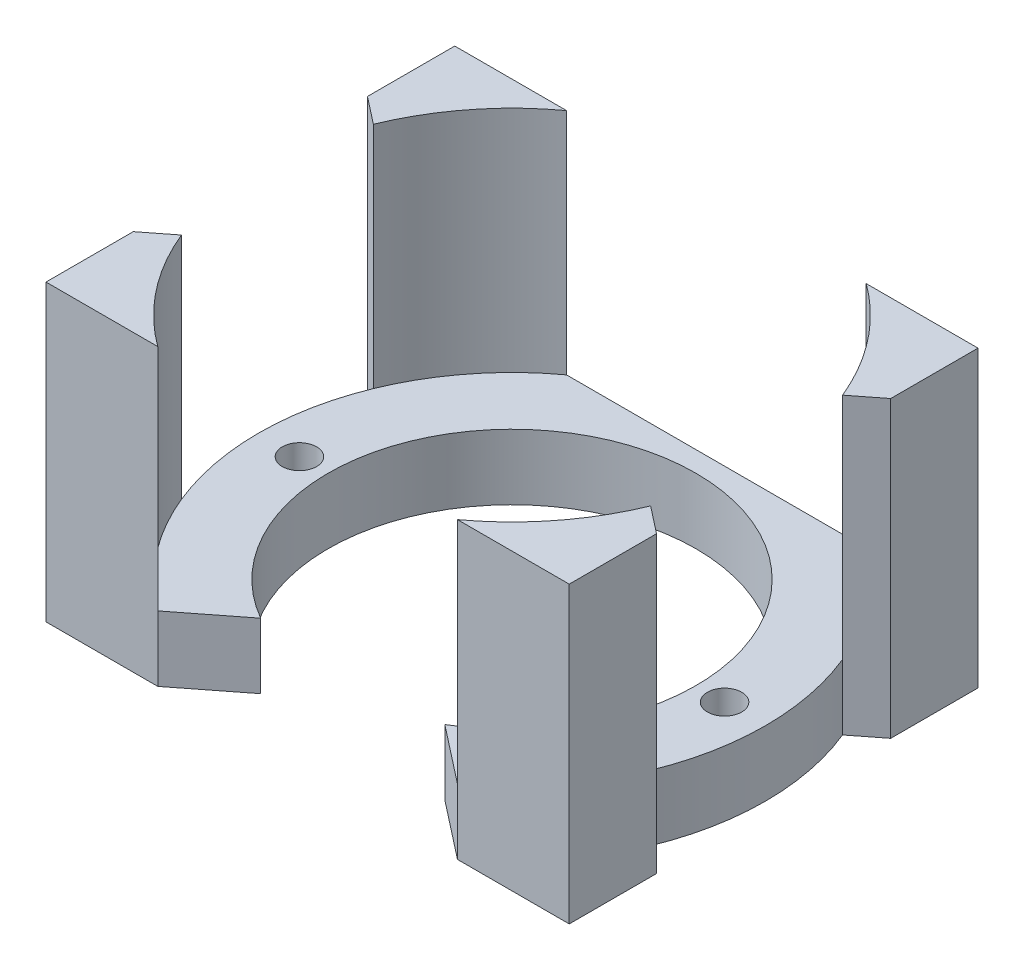
ISO-10303-21;
HEADER;
FILE_DESCRIPTION(('STEP AP214'),'2;1');
FILE_NAME('part.step','',(''),(''),'','','');
FILE_SCHEMA(('AUTOMOTIVE_DESIGN { 1 0 10303 214 1 1 1 1 }'));
ENDSEC;
DATA;
#1=APPLICATION_CONTEXT('core data for automotive mechanical design processes');
#2=APPLICATION_PROTOCOL_DEFINITION('international standard','automotive_design',2000,#1);
#3=PRODUCT_CONTEXT('',#1,'mechanical');
#4=PRODUCT('Part','Part','',(#3));
#5=PRODUCT_RELATED_PRODUCT_CATEGORY('part','',(#4));
#6=PRODUCT_DEFINITION_FORMATION('','',#4);
#7=PRODUCT_DEFINITION_CONTEXT('part definition',#1,'design');
#8=PRODUCT_DEFINITION('design','',#6,#7);
#9=PRODUCT_DEFINITION_SHAPE('','',#8);
#10=(LENGTH_UNIT() NAMED_UNIT(*) SI_UNIT(.MILLI.,.METRE.));
#11=(NAMED_UNIT(*) PLANE_ANGLE_UNIT() SI_UNIT($,.RADIAN.));
#12=(NAMED_UNIT(*) SI_UNIT($,.STERADIAN.) SOLID_ANGLE_UNIT());
#13=UNCERTAINTY_MEASURE_WITH_UNIT(LENGTH_MEASURE(1.E-05),#10,'distance_accuracy_value','');
#14=(GEOMETRIC_REPRESENTATION_CONTEXT(3) GLOBAL_UNCERTAINTY_ASSIGNED_CONTEXT((#13)) GLOBAL_UNIT_ASSIGNED_CONTEXT((#10,
#11,#12)) REPRESENTATION_CONTEXT('',''));
#15=CARTESIAN_POINT('',(0.,0.,0.));
#16=DIRECTION('',(0.,0.,1.));
#17=DIRECTION('',(1.,0.,0.));
#18=AXIS2_PLACEMENT_3D('',#15,#16,#17);
#19=CARTESIAN_POINT('',(0.,8.,0.));
#20=DIRECTION('',(0.,-1.,0.));
#21=DIRECTION('',(0.,0.,-1.));
#22=AXIS2_PLACEMENT_3D('',#19,#20,#21);
#23=CYLINDRICAL_SURFACE('',#22,22.5);
#24=CARTESIAN_POINT('',(0.,0.,0.));
#25=DIRECTION('',(0.,1.,0.));
#26=DIRECTION('',(0.,0.,1.));
#27=AXIS2_PLACEMENT_3D('',#24,#25,#26);
#28=CIRCLE('',#27,22.5);
#29=CARTESIAN_POINT('',(11.2625516975975,0.,19.4783194670111));
#30=VERTEX_POINT('',#29);
#31=CARTESIAN_POINT('',(-11.2625516975975,0.,19.4783194670111));
#32=VERTEX_POINT('',#31);
#33=EDGE_CURVE('E271',#30,#32,#28,.T.);
#34=ORIENTED_EDGE('',*,*,#33,.F.);
#35=DIRECTION('',(0.,-1.,0.));
#36=VECTOR('',#35,1.);
#37=CARTESIAN_POINT('',(11.2625516975975,8.,19.4783194670111));
#38=LINE('',#37,#36);
#39=CARTESIAN_POINT('',(11.2625516975975,8.,19.4783194670111));
#40=VERTEX_POINT('',#39);
#41=EDGE_CURVE('E11',#40,#30,#38,.T.);
#42=ORIENTED_EDGE('',*,*,#41,.F.);
#43=CARTESIAN_POINT('',(0.,8.,0.));
#44=DIRECTION('',(0.,1.,0.));
#45=DIRECTION('',(0.,0.,1.));
#46=AXIS2_PLACEMENT_3D('',#43,#44,#45);
#47=CIRCLE('',#46,22.5);
#48=CARTESIAN_POINT('',(-11.2625516975975,8.,19.4783194670111));
#49=VERTEX_POINT('',#48);
#50=EDGE_CURVE('E272',#40,#49,#47,.T.);
#51=ORIENTED_EDGE('',*,*,#50,.T.);
#52=DIRECTION('',(0.,-1.,0.));
#53=VECTOR('',#52,1.);
#54=CARTESIAN_POINT('',(-11.2625516975975,8.,19.4783194670111));
#55=LINE('',#54,#53);
#56=EDGE_CURVE('E53',#49,#32,#55,.T.);
#57=ORIENTED_EDGE('',*,*,#56,.T.);
#58=EDGE_LOOP('',(#34,#42,#51,#57));
#59=FACE_BOUND('',#58,.T.);
#60=ADVANCED_FACE('F37',(#59),#23,.F.);
#61=CARTESIAN_POINT('',(-5.181055647429,8.,6.63175122870916));
#62=DIRECTION('',(0.615644041972313,0.,-0.788024373724565));
#63=DIRECTION('',(-0.788024373724565,0.,-0.615644041972313));
#64=AXIS2_PLACEMENT_3D('',#61,#62,#63);
#65=PLANE('',#64);
#66=DIRECTION('',(0.788024373724565,0.,0.615644041972313));
#67=VECTOR('',#66,1.);
#68=CARTESIAN_POINT('',(-5.181055647429,0.,6.63175122870916));
#69=LINE('',#68,#67);
#70=CARTESIAN_POINT('',(18.3303027798234,0.,25.));
#71=VERTEX_POINT('',#70);
#72=EDGE_CURVE('E294',#30,#71,#69,.T.);
#73=ORIENTED_EDGE('',*,*,#72,.T.);
#74=DIRECTION('',(0.,-1.,0.));
#75=VECTOR('',#74,1.);
#76=CARTESIAN_POINT('',(18.3303027798234,8.,25.));
#77=LINE('',#76,#75);
#78=CARTESIAN_POINT('',(18.3303027798234,8.,25.));
#79=VERTEX_POINT('',#78);
#80=EDGE_CURVE('E45',#79,#71,#77,.T.);
#81=ORIENTED_EDGE('',*,*,#80,.F.);
#82=DIRECTION('',(0.788024373724565,0.,0.615644041972313));
#83=VECTOR('',#82,1.);
#84=CARTESIAN_POINT('',(-5.181055647429,8.,6.63175122870916));
#85=LINE('',#84,#83);
#86=EDGE_CURVE('E274',#40,#79,#85,.T.);
#87=ORIENTED_EDGE('',*,*,#86,.F.);
#88=ORIENTED_EDGE('',*,*,#41,.T.);
#89=EDGE_LOOP('',(#73,#81,#87,#88));
#90=FACE_BOUND('',#89,.T.);
#91=ADVANCED_FACE('F371',(#90),#65,.F.);
#92=CARTESIAN_POINT('',(0.,8.,25.));
#93=DIRECTION('',(0.,0.,1.));
#94=DIRECTION('',(1.,0.,0.));
#95=AXIS2_PLACEMENT_3D('',#92,#93,#94);
#96=PLANE('',#95);
#97=DIRECTION('',(-1.,0.,0.));
#98=VECTOR('',#97,1.);
#99=CARTESIAN_POINT('',(0.,0.,25.));
#100=LINE('',#99,#98);
#101=CARTESIAN_POINT('',(32.,0.,25.));
#102=VERTEX_POINT('',#101);
#103=EDGE_CURVE('E297',#102,#71,#100,.T.);
#104=ORIENTED_EDGE('',*,*,#103,.F.);
#105=DIRECTION('',(0.,-1.,0.));
#106=VECTOR('',#105,1.);
#107=CARTESIAN_POINT('',(32.,8.,25.));
#108=LINE('',#107,#106);
#109=CARTESIAN_POINT('',(32.,36.,25.));
#110=VERTEX_POINT('',#109);
#111=EDGE_CURVE('E204',#110,#102,#108,.T.);
#112=ORIENTED_EDGE('',*,*,#111,.F.);
#113=DIRECTION('',(-1.,0.,0.));
#114=VECTOR('',#113,1.);
#115=CARTESIAN_POINT('',(0.,36.,25.));
#116=LINE('',#115,#114);
#117=CARTESIAN_POINT('',(18.3303027798234,36.,25.));
#118=VERTEX_POINT('',#117);
#119=EDGE_CURVE('E198',#110,#118,#116,.T.);
#120=ORIENTED_EDGE('',*,*,#119,.T.);
#121=DIRECTION('',(0.,-1.,0.));
#122=VECTOR('',#121,1.);
#123=CARTESIAN_POINT('',(18.3303027798234,36.,25.));
#124=LINE('',#123,#122);
#125=EDGE_CURVE('E182',#118,#79,#124,.T.);
#126=ORIENTED_EDGE('',*,*,#125,.T.);
#127=ORIENTED_EDGE('',*,*,#80,.T.);
#128=EDGE_LOOP('',(#104,#112,#120,#126,#127));
#129=FACE_BOUND('',#128,.T.);
#130=ADVANCED_FACE('F203',(#129),#96,.T.);
#131=CARTESIAN_POINT('',(32.,8.,0.));
#132=DIRECTION('',(-1.,0.,0.));
#133=DIRECTION('',(0.,0.,1.));
#134=AXIS2_PLACEMENT_3D('',#131,#132,#133);
#135=PLANE('',#134);
#136=DIRECTION('',(0.,0.,-1.));
#137=VECTOR('',#136,1.);
#138=CARTESIAN_POINT('',(32.,0.,0.));
#139=LINE('',#138,#137);
#140=CARTESIAN_POINT('',(32.,0.,14.320549046737));
#141=VERTEX_POINT('',#140);
#142=EDGE_CURVE('E300',#102,#141,#139,.T.);
#143=ORIENTED_EDGE('',*,*,#142,.T.);
#144=DIRECTION('',(0.,-1.,0.));
#145=VECTOR('',#144,1.);
#146=CARTESIAN_POINT('',(32.,8.,14.320549046737));
#147=LINE('',#146,#145);
#148=CARTESIAN_POINT('',(32.,36.,14.320549046737));
#149=VERTEX_POINT('',#148);
#150=EDGE_CURVE('E366',#149,#141,#147,.T.);
#151=ORIENTED_EDGE('',*,*,#150,.F.);
#152=DIRECTION('',(0.,0.,-1.));
#153=VECTOR('',#152,1.);
#154=CARTESIAN_POINT('',(32.,36.,0.));
#155=LINE('',#154,#153);
#156=EDGE_CURVE('E206',#110,#149,#155,.T.);
#157=ORIENTED_EDGE('',*,*,#156,.F.);
#158=ORIENTED_EDGE('',*,*,#111,.T.);
#159=EDGE_LOOP('',(#143,#151,#157,#158));
#160=FACE_BOUND('',#159,.T.);
#161=ADVANCED_FACE('F379',(#160),#135,.F.);
#162=CARTESIAN_POINT('',(5.18105564742899,8.,-6.63175122870911));
#163=DIRECTION('',(0.615644041972315,0.,-0.788024373724563));
#164=DIRECTION('',(-0.788024373724563,0.,-0.615644041972315));
#165=AXIS2_PLACEMENT_3D('',#162,#163,#164);
#166=PLANE('',#165);
#167=DIRECTION('',(0.788024373724563,0.,0.615644041972315));
#168=VECTOR('',#167,1.);
#169=CARTESIAN_POINT('',(5.18105564742899,0.,-6.63175122870911));
#170=LINE('',#169,#168);
#171=CARTESIAN_POINT('',(28.6924140746813,0.,11.7364975425818));
#172=VERTEX_POINT('',#171);
#173=EDGE_CURVE('E303',#172,#141,#170,.T.);
#174=ORIENTED_EDGE('',*,*,#173,.F.);
#175=DIRECTION('',(0.,-1.,0.));
#176=VECTOR('',#175,1.);
#177=CARTESIAN_POINT('',(28.6924140746813,8.,11.7364975425818));
#178=LINE('',#177,#176);
#179=CARTESIAN_POINT('',(28.6924140746813,8.,11.7364975425818));
#180=VERTEX_POINT('',#179);
#181=EDGE_CURVE('E364',#180,#172,#178,.T.);
#182=ORIENTED_EDGE('',*,*,#181,.F.);
#183=DIRECTION('',(0.,-1.,0.));
#184=VECTOR('',#183,1.);
#185=CARTESIAN_POINT('',(28.6924140746813,36.,11.7364975425818));
#186=LINE('',#185,#184);
#187=CARTESIAN_POINT('',(28.6924140746813,36.,11.7364975425818));
#188=VERTEX_POINT('',#187);
#189=EDGE_CURVE('E192',#188,#180,#186,.T.);
#190=ORIENTED_EDGE('',*,*,#189,.F.);
#191=DIRECTION('',(0.788024373724563,0.,0.615644041972315));
#192=VECTOR('',#191,1.);
#193=CARTESIAN_POINT('',(5.18105564742899,36.,-6.63175122870911));
#194=LINE('',#193,#192);
#195=EDGE_CURVE('E200',#188,#149,#194,.T.);
#196=ORIENTED_EDGE('',*,*,#195,.T.);
#197=ORIENTED_EDGE('',*,*,#150,.T.);
#198=EDGE_LOOP('',(#174,#182,#190,#196,#197));
#199=FACE_BOUND('',#198,.T.);
#200=ADVANCED_FACE('F381',(#199),#166,.T.);
#201=CARTESIAN_POINT('',(0.,8.,0.));
#202=DIRECTION('',(0.,-1.,0.));
#203=DIRECTION('',(0.,0.,-1.));
#204=AXIS2_PLACEMENT_3D('',#201,#202,#203);
#205=CYLINDRICAL_SURFACE('',#204,31.);
#206=CARTESIAN_POINT('',(0.,0.,0.));
#207=DIRECTION('',(0.,1.,0.));
#208=DIRECTION('',(0.,0.,1.));
#209=AXIS2_PLACEMENT_3D('',#206,#207,#208);
#210=CIRCLE('',#209,31.);
#211=CARTESIAN_POINT('',(28.6924140746813,0.,-11.7364975425818));
#212=VERTEX_POINT('',#211);
#213=EDGE_CURVE('E306',#172,#212,#210,.T.);
#214=ORIENTED_EDGE('',*,*,#213,.T.);
#215=DIRECTION('',(0.,-1.,0.));
#216=VECTOR('',#215,1.);
#217=CARTESIAN_POINT('',(28.6924140746813,8.,-11.7364975425818));
#218=LINE('',#217,#216);
#219=CARTESIAN_POINT('',(28.6924140746813,8.,-11.7364975425818));
#220=VERTEX_POINT('',#219);
#221=EDGE_CURVE('E361',#220,#212,#218,.T.);
#222=ORIENTED_EDGE('',*,*,#221,.F.);
#223=CARTESIAN_POINT('',(0.,8.,0.));
#224=DIRECTION('',(0.,1.,0.));
#225=DIRECTION('',(0.,0.,1.));
#226=AXIS2_PLACEMENT_3D('',#223,#224,#225);
#227=CIRCLE('',#226,31.);
#228=EDGE_CURVE('E277',#180,#220,#227,.T.);
#229=ORIENTED_EDGE('',*,*,#228,.F.);
#230=ORIENTED_EDGE('',*,*,#181,.T.);
#231=EDGE_LOOP('',(#214,#222,#229,#230));
#232=FACE_BOUND('',#231,.T.);
#233=ADVANCED_FACE('F405',(#232),#205,.T.);
#234=CARTESIAN_POINT('',(5.18105564742899,8.,6.6317512287091));
#235=DIRECTION('',(-0.615644041972316,0.,-0.788024373724563));
#236=DIRECTION('',(-0.788024373724563,0.,0.615644041972316));
#237=AXIS2_PLACEMENT_3D('',#234,#235,#236);
#238=PLANE('',#237);
#239=DIRECTION('',(0.788024373724563,0.,-0.615644041972316));
#240=VECTOR('',#239,1.);
#241=CARTESIAN_POINT('',(5.18105564742899,0.,6.6317512287091));
#242=LINE('',#241,#240);
#243=CARTESIAN_POINT('',(32.,0.,-14.320549046737));
#244=VERTEX_POINT('',#243);
#245=EDGE_CURVE('E308',#212,#244,#242,.T.);
#246=ORIENTED_EDGE('',*,*,#245,.T.);
#247=DIRECTION('',(0.,-1.,0.));
#248=VECTOR('',#247,1.);
#249=CARTESIAN_POINT('',(32.,8.,-14.320549046737));
#250=LINE('',#249,#248);
#251=CARTESIAN_POINT('',(32.,36.,-14.320549046737));
#252=VERTEX_POINT('',#251);
#253=EDGE_CURVE('E358',#252,#244,#250,.T.);
#254=ORIENTED_EDGE('',*,*,#253,.F.);
#255=DIRECTION('',(0.788024373724563,0.,-0.615644041972316));
#256=VECTOR('',#255,1.);
#257=CARTESIAN_POINT('',(5.18105564742899,36.,6.6317512287091));
#258=LINE('',#257,#256);
#259=CARTESIAN_POINT('',(28.6924140746813,36.,-11.7364975425818));
#260=VERTEX_POINT('',#259);
#261=EDGE_CURVE('E254',#260,#252,#258,.T.);
#262=ORIENTED_EDGE('',*,*,#261,.F.);
#263=DIRECTION('',(0.,-1.,0.));
#264=VECTOR('',#263,1.);
#265=CARTESIAN_POINT('',(28.6924140746813,36.,-11.7364975425818));
#266=LINE('',#265,#264);
#267=EDGE_CURVE('E265',#260,#220,#266,.T.);
#268=ORIENTED_EDGE('',*,*,#267,.T.);
#269=ORIENTED_EDGE('',*,*,#221,.T.);
#270=EDGE_LOOP('',(#246,#254,#262,#268,#269));
#271=FACE_BOUND('',#270,.T.);
#272=ADVANCED_FACE('F408',(#271),#238,.F.);
#273=CARTESIAN_POINT('',(32.,8.,0.));
#274=DIRECTION('',(-1.,0.,0.));
#275=DIRECTION('',(0.,0.,1.));
#276=AXIS2_PLACEMENT_3D('',#273,#274,#275);
#277=PLANE('',#276);
#278=DIRECTION('',(0.,0.,-1.));
#279=VECTOR('',#278,1.);
#280=CARTESIAN_POINT('',(32.,0.,0.));
#281=LINE('',#280,#279);
#282=CARTESIAN_POINT('',(32.,0.,-25.));
#283=VERTEX_POINT('',#282);
#284=EDGE_CURVE('E310',#244,#283,#281,.T.);
#285=ORIENTED_EDGE('',*,*,#284,.T.);
#286=DIRECTION('',(0.,-1.,0.));
#287=VECTOR('',#286,1.);
#288=CARTESIAN_POINT('',(32.,8.,-25.));
#289=LINE('',#288,#287);
#290=CARTESIAN_POINT('',(32.,36.,-25.));
#291=VERTEX_POINT('',#290);
#292=EDGE_CURVE('E355',#291,#283,#289,.T.);
#293=ORIENTED_EDGE('',*,*,#292,.F.);
#294=DIRECTION('',(0.,0.,-1.));
#295=VECTOR('',#294,1.);
#296=CARTESIAN_POINT('',(32.,36.,0.));
#297=LINE('',#296,#295);
#298=EDGE_CURVE('E257',#252,#291,#297,.T.);
#299=ORIENTED_EDGE('',*,*,#298,.F.);
#300=ORIENTED_EDGE('',*,*,#253,.T.);
#301=EDGE_LOOP('',(#285,#293,#299,#300));
#302=FACE_BOUND('',#301,.T.);
#303=ADVANCED_FACE('F412',(#302),#277,.F.);
#304=CARTESIAN_POINT('',(0.,8.,-25.));
#305=DIRECTION('',(0.,0.,1.));
#306=DIRECTION('',(1.,0.,0.));
#307=AXIS2_PLACEMENT_3D('',#304,#305,#306);
#308=PLANE('',#307);
#309=DIRECTION('',(-1.,0.,0.));
#310=VECTOR('',#309,1.);
#311=CARTESIAN_POINT('',(0.,0.,-25.));
#312=LINE('',#311,#310);
#313=CARTESIAN_POINT('',(-32.,0.,-25.));
#314=VERTEX_POINT('',#313);
#315=EDGE_CURVE('E312',#283,#314,#312,.T.);
#316=ORIENTED_EDGE('',*,*,#315,.T.);
#317=DIRECTION('',(0.,-1.,0.));
#318=VECTOR('',#317,1.);
#319=CARTESIAN_POINT('',(-32.,8.,-25.));
#320=LINE('',#319,#318);
#321=CARTESIAN_POINT('',(-32.,36.,-25.));
#322=VERTEX_POINT('',#321);
#323=EDGE_CURVE('E352',#322,#314,#320,.T.);
#324=ORIENTED_EDGE('',*,*,#323,.F.);
#325=DIRECTION('',(-1.,0.,0.));
#326=VECTOR('',#325,1.);
#327=CARTESIAN_POINT('',(0.,36.,-25.));
#328=LINE('',#327,#326);
#329=CARTESIAN_POINT('',(-18.3303027798233,36.,-25.));
#330=VERTEX_POINT('',#329);
#331=EDGE_CURVE('E235',#330,#322,#328,.T.);
#332=ORIENTED_EDGE('',*,*,#331,.F.);
#333=DIRECTION('',(0.,-1.,0.));
#334=VECTOR('',#333,1.);
#335=CARTESIAN_POINT('',(-18.3303027798233,36.,-25.));
#336=LINE('',#335,#334);
#337=CARTESIAN_POINT('',(-18.3303027798233,8.,-25.));
#338=VERTEX_POINT('',#337);
#339=EDGE_CURVE('E246',#330,#338,#336,.T.);
#340=ORIENTED_EDGE('',*,*,#339,.T.);
#341=DIRECTION('',(-1.,0.,0.));
#342=VECTOR('',#341,1.);
#343=CARTESIAN_POINT('',(0.,8.,-25.));
#344=LINE('',#343,#342);
#345=CARTESIAN_POINT('',(18.3303027798234,8.,-25.));
#346=VERTEX_POINT('',#345);
#347=EDGE_CURVE('E279',#346,#338,#344,.T.);
#348=ORIENTED_EDGE('',*,*,#347,.F.);
#349=DIRECTION('',(0.,-1.,0.));
#350=VECTOR('',#349,1.);
#351=CARTESIAN_POINT('',(18.3303027798234,36.,-25.));
#352=LINE('',#351,#350);
#353=CARTESIAN_POINT('',(18.3303027798234,36.,-25.));
#354=VERTEX_POINT('',#353);
#355=EDGE_CURVE('E262',#354,#346,#352,.T.);
#356=ORIENTED_EDGE('',*,*,#355,.F.);
#357=DIRECTION('',(-1.,0.,0.));
#358=VECTOR('',#357,1.);
#359=CARTESIAN_POINT('',(0.,36.,-25.));
#360=LINE('',#359,#358);
#361=EDGE_CURVE('E260',#291,#354,#360,.T.);
#362=ORIENTED_EDGE('',*,*,#361,.F.);
#363=ORIENTED_EDGE('',*,*,#292,.T.);
#364=EDGE_LOOP('',(#316,#324,#332,#340,#348,#356,#362,#363));
#365=FACE_BOUND('',#364,.T.);
#366=ADVANCED_FACE('F416',(#365),#308,.F.);
#367=CARTESIAN_POINT('',(-32.,8.,0.));
#368=DIRECTION('',(-1.,0.,0.));
#369=DIRECTION('',(0.,0.,1.));
#370=AXIS2_PLACEMENT_3D('',#367,#368,#369);
#371=PLANE('',#370);
#372=DIRECTION('',(0.,0.,-1.));
#373=VECTOR('',#372,1.);
#374=CARTESIAN_POINT('',(-32.,0.,0.));
#375=LINE('',#374,#373);
#376=CARTESIAN_POINT('',(-32.,0.,-14.320549046737));
#377=VERTEX_POINT('',#376);
#378=EDGE_CURVE('E314',#377,#314,#375,.T.);
#379=ORIENTED_EDGE('',*,*,#378,.F.);
#380=DIRECTION('',(0.,-1.,0.));
#381=VECTOR('',#380,1.);
#382=CARTESIAN_POINT('',(-32.,8.,-14.320549046737));
#383=LINE('',#382,#381);
#384=CARTESIAN_POINT('',(-32.,36.,-14.320549046737));
#385=VERTEX_POINT('',#384);
#386=EDGE_CURVE('E350',#385,#377,#383,.T.);
#387=ORIENTED_EDGE('',*,*,#386,.F.);
#388=DIRECTION('',(0.,0.,-1.));
#389=VECTOR('',#388,1.);
#390=CARTESIAN_POINT('',(-32.,36.,0.));
#391=LINE('',#390,#389);
#392=EDGE_CURVE('E238',#385,#322,#391,.T.);
#393=ORIENTED_EDGE('',*,*,#392,.T.);
#394=ORIENTED_EDGE('',*,*,#323,.T.);
#395=EDGE_LOOP('',(#379,#387,#393,#394));
#396=FACE_BOUND('',#395,.T.);
#397=ADVANCED_FACE('F420',(#396),#371,.T.);
#398=CARTESIAN_POINT('',(-5.181055647429,8.,6.63175122870911));
#399=DIRECTION('',(-0.615644041972316,0.,0.788024373724563));
#400=DIRECTION('',(0.788024373724563,0.,0.615644041972316));
#401=AXIS2_PLACEMENT_3D('',#398,#399,#400);
#402=PLANE('',#401);
#403=DIRECTION('',(-0.788024373724563,0.,-0.615644041972316));
#404=VECTOR('',#403,1.);
#405=CARTESIAN_POINT('',(-5.181055647429,0.,6.63175122870911));
#406=LINE('',#405,#404);
#407=CARTESIAN_POINT('',(-28.6924140746813,0.,-11.7364975425818));
#408=VERTEX_POINT('',#407);
#409=EDGE_CURVE('E317',#408,#377,#406,.T.);
#410=ORIENTED_EDGE('',*,*,#409,.F.);
#411=DIRECTION('',(0.,-1.,0.));
#412=VECTOR('',#411,1.);
#413=CARTESIAN_POINT('',(-28.6924140746813,8.,-11.7364975425818));
#414=LINE('',#413,#412);
#415=CARTESIAN_POINT('',(-28.6924140746813,8.,-11.7364975425818));
#416=VERTEX_POINT('',#415);
#417=EDGE_CURVE('E348',#416,#408,#414,.T.);
#418=ORIENTED_EDGE('',*,*,#417,.F.);
#419=DIRECTION('',(0.,-1.,0.));
#420=VECTOR('',#419,1.);
#421=CARTESIAN_POINT('',(-28.6924140746813,36.,-11.7364975425818));
#422=LINE('',#421,#420);
#423=CARTESIAN_POINT('',(-28.6924140746813,36.,-11.7364975425818));
#424=VERTEX_POINT('',#423);
#425=EDGE_CURVE('E244',#424,#416,#422,.T.);
#426=ORIENTED_EDGE('',*,*,#425,.F.);
#427=DIRECTION('',(-0.788024373724563,0.,-0.615644041972316));
#428=VECTOR('',#427,1.);
#429=CARTESIAN_POINT('',(-5.181055647429,36.,6.63175122870911));
#430=LINE('',#429,#428);
#431=EDGE_CURVE('E241',#424,#385,#430,.T.);
#432=ORIENTED_EDGE('',*,*,#431,.T.);
#433=ORIENTED_EDGE('',*,*,#386,.T.);
#434=EDGE_LOOP('',(#410,#418,#426,#432,#433));
#435=FACE_BOUND('',#434,.T.);
#436=ADVANCED_FACE('F424',(#435),#402,.T.);
#437=CARTESIAN_POINT('',(0.,8.,0.));
#438=DIRECTION('',(0.,-1.,0.));
#439=DIRECTION('',(0.,0.,-1.));
#440=AXIS2_PLACEMENT_3D('',#437,#438,#439);
#441=CYLINDRICAL_SURFACE('',#440,31.);
#442=CARTESIAN_POINT('',(0.,0.,0.));
#443=DIRECTION('',(0.,1.,0.));
#444=DIRECTION('',(0.,0.,1.));
#445=AXIS2_PLACEMENT_3D('',#442,#443,#444);
#446=CIRCLE('',#445,31.);
#447=CARTESIAN_POINT('',(-28.6924140746813,0.,11.7364975425818));
#448=VERTEX_POINT('',#447);
#449=EDGE_CURVE('E320',#408,#448,#446,.T.);
#450=ORIENTED_EDGE('',*,*,#449,.T.);
#451=DIRECTION('',(0.,-1.,0.));
#452=VECTOR('',#451,1.);
#453=CARTESIAN_POINT('',(-28.6924140746813,8.,11.7364975425818));
#454=LINE('',#453,#452);
#455=CARTESIAN_POINT('',(-28.6924140746813,8.,11.7364975425818));
#456=VERTEX_POINT('',#455);
#457=EDGE_CURVE('E345',#456,#448,#454,.T.);
#458=ORIENTED_EDGE('',*,*,#457,.F.);
#459=CARTESIAN_POINT('',(0.,8.,0.));
#460=DIRECTION('',(0.,1.,0.));
#461=DIRECTION('',(0.,0.,1.));
#462=AXIS2_PLACEMENT_3D('',#459,#460,#461);
#463=CIRCLE('',#462,31.);
#464=EDGE_CURVE('E282',#416,#456,#463,.T.);
#465=ORIENTED_EDGE('',*,*,#464,.F.);
#466=ORIENTED_EDGE('',*,*,#417,.T.);
#467=EDGE_LOOP('',(#450,#458,#465,#466));
#468=FACE_BOUND('',#467,.T.);
#469=ADVANCED_FACE('F428',(#468),#441,.T.);
#470=CARTESIAN_POINT('',(-5.181055647429,8.,-6.63175122870911));
#471=DIRECTION('',(0.615644041972316,0.,0.788024373724563));
#472=DIRECTION('',(0.788024373724563,0.,-0.615644041972316));
#473=AXIS2_PLACEMENT_3D('',#470,#471,#472);
#474=PLANE('',#473);
#475=DIRECTION('',(-0.788024373724563,0.,0.615644041972316));
#476=VECTOR('',#475,1.);
#477=CARTESIAN_POINT('',(-5.181055647429,0.,-6.63175122870911));
#478=LINE('',#477,#476);
#479=CARTESIAN_POINT('',(-32.,0.,14.320549046737));
#480=VERTEX_POINT('',#479);
#481=EDGE_CURVE('E322',#448,#480,#478,.T.);
#482=ORIENTED_EDGE('',*,*,#481,.T.);
#483=DIRECTION('',(0.,-1.,0.));
#484=VECTOR('',#483,1.);
#485=CARTESIAN_POINT('',(-32.,8.,14.320549046737));
#486=LINE('',#485,#484);
#487=CARTESIAN_POINT('',(-32.,36.,14.320549046737));
#488=VERTEX_POINT('',#487);
#489=EDGE_CURVE('E343',#488,#480,#486,.T.);
#490=ORIENTED_EDGE('',*,*,#489,.F.);
#491=DIRECTION('',(-0.788024373724563,0.,0.615644041972316));
#492=VECTOR('',#491,1.);
#493=CARTESIAN_POINT('',(-5.181055647429,36.,-6.63175122870911));
#494=LINE('',#493,#492);
#495=CARTESIAN_POINT('',(-28.6924140746813,36.,11.7364975425818));
#496=VERTEX_POINT('',#495);
#497=EDGE_CURVE('E216',#496,#488,#494,.T.);
#498=ORIENTED_EDGE('',*,*,#497,.F.);
#499=DIRECTION('',(0.,-1.,0.));
#500=VECTOR('',#499,1.);
#501=CARTESIAN_POINT('',(-28.6924140746813,36.,11.7364975425818));
#502=LINE('',#501,#500);
#503=EDGE_CURVE('E227',#496,#456,#502,.T.);
#504=ORIENTED_EDGE('',*,*,#503,.T.);
#505=ORIENTED_EDGE('',*,*,#457,.T.);
#506=EDGE_LOOP('',(#482,#490,#498,#504,#505));
#507=FACE_BOUND('',#506,.T.);
#508=ADVANCED_FACE('F432',(#507),#474,.F.);
#509=CARTESIAN_POINT('',(-32.,8.,0.));
#510=DIRECTION('',(-1.,0.,0.));
#511=DIRECTION('',(0.,0.,1.));
#512=AXIS2_PLACEMENT_3D('',#509,#510,#511);
#513=PLANE('',#512);
#514=DIRECTION('',(0.,0.,-1.));
#515=VECTOR('',#514,1.);
#516=CARTESIAN_POINT('',(-32.,0.,0.));
#517=LINE('',#516,#515);
#518=CARTESIAN_POINT('',(-32.,0.,25.));
#519=VERTEX_POINT('',#518);
#520=EDGE_CURVE('E325',#519,#480,#517,.T.);
#521=ORIENTED_EDGE('',*,*,#520,.F.);
#522=DIRECTION('',(0.,-1.,0.));
#523=VECTOR('',#522,1.);
#524=CARTESIAN_POINT('',(-32.,8.,25.));
#525=LINE('',#524,#523);
#526=CARTESIAN_POINT('',(-32.,36.,25.));
#527=VERTEX_POINT('',#526);
#528=EDGE_CURVE('E341',#527,#519,#525,.T.);
#529=ORIENTED_EDGE('',*,*,#528,.F.);
#530=DIRECTION('',(0.,0.,-1.));
#531=VECTOR('',#530,1.);
#532=CARTESIAN_POINT('',(-32.,36.,0.));
#533=LINE('',#532,#531);
#534=EDGE_CURVE('E219',#527,#488,#533,.T.);
#535=ORIENTED_EDGE('',*,*,#534,.T.);
#536=ORIENTED_EDGE('',*,*,#489,.T.);
#537=EDGE_LOOP('',(#521,#529,#535,#536));
#538=FACE_BOUND('',#537,.T.);
#539=ADVANCED_FACE('F436',(#538),#513,.T.);
#540=CARTESIAN_POINT('',(0.,8.,25.));
#541=DIRECTION('',(0.,0.,1.));
#542=DIRECTION('',(1.,0.,0.));
#543=AXIS2_PLACEMENT_3D('',#540,#541,#542);
#544=PLANE('',#543);
#545=DIRECTION('',(-1.,0.,0.));
#546=VECTOR('',#545,1.);
#547=CARTESIAN_POINT('',(0.,0.,25.));
#548=LINE('',#547,#546);
#549=CARTESIAN_POINT('',(-18.3303027798234,0.,25.));
#550=VERTEX_POINT('',#549);
#551=EDGE_CURVE('E328',#550,#519,#548,.T.);
#552=ORIENTED_EDGE('',*,*,#551,.F.);
#553=DIRECTION('',(0.,-1.,0.));
#554=VECTOR('',#553,1.);
#555=CARTESIAN_POINT('',(-18.3303027798234,8.,25.));
#556=LINE('',#555,#554);
#557=CARTESIAN_POINT('',(-18.3303027798234,8.,25.));
#558=VERTEX_POINT('',#557);
#559=EDGE_CURVE('E104',#558,#550,#556,.T.);
#560=ORIENTED_EDGE('',*,*,#559,.F.);
#561=DIRECTION('',(0.,-1.,0.));
#562=VECTOR('',#561,1.);
#563=CARTESIAN_POINT('',(-18.3303027798234,36.,25.));
#564=LINE('',#563,#562);
#565=CARTESIAN_POINT('',(-18.3303027798234,36.,25.));
#566=VERTEX_POINT('',#565);
#567=EDGE_CURVE('E225',#566,#558,#564,.T.);
#568=ORIENTED_EDGE('',*,*,#567,.F.);
#569=DIRECTION('',(-1.,0.,0.));
#570=VECTOR('',#569,1.);
#571=CARTESIAN_POINT('',(0.,36.,25.));
#572=LINE('',#571,#570);
#573=EDGE_CURVE('E222',#566,#527,#572,.T.);
#574=ORIENTED_EDGE('',*,*,#573,.T.);
#575=ORIENTED_EDGE('',*,*,#528,.T.);
#576=EDGE_LOOP('',(#552,#560,#568,#574,#575));
#577=FACE_BOUND('',#576,.T.);
#578=ADVANCED_FACE('F440',(#577),#544,.T.);
#579=CARTESIAN_POINT('',(-26.,8.,0.));
#580=DIRECTION('',(0.,-1.,0.));
#581=DIRECTION('',(0.,0.,-1.));
#582=AXIS2_PLACEMENT_3D('',#579,#580,#581);
#583=CYLINDRICAL_SURFACE('',#582,2.1);
#584=CARTESIAN_POINT('',(-26.,8.,0.));
#585=DIRECTION('',(0.,1.,0.));
#586=DIRECTION('',(0.,0.,1.));
#587=AXIS2_PLACEMENT_3D('',#584,#585,#586);
#588=CIRCLE('',#587,2.1);
#589=CARTESIAN_POINT('',(-26.,8.,2.10000000000001));
#590=VERTEX_POINT('',#589);
#591=EDGE_CURVE('E287',#590,#590,#588,.T.);
#592=ORIENTED_EDGE('',*,*,#591,.T.);
#593=EDGE_LOOP('',(#592));
#594=FACE_BOUND('',#593,.T.);
#595=CARTESIAN_POINT('',(-26.,0.,0.));
#596=DIRECTION('',(0.,1.,0.));
#597=DIRECTION('',(0.,0.,1.));
#598=AXIS2_PLACEMENT_3D('',#595,#596,#597);
#599=CIRCLE('',#598,2.1);
#600=CARTESIAN_POINT('',(-26.,0.,2.10000000000001));
#601=VERTEX_POINT('',#600);
#602=EDGE_CURVE('E334',#601,#601,#599,.T.);
#603=ORIENTED_EDGE('',*,*,#602,.F.);
#604=EDGE_LOOP('',(#603));
#605=FACE_BOUND('',#604,.T.);
#606=ADVANCED_FACE('F444',(#594,#605),#583,.F.);
#607=CARTESIAN_POINT('',(5.181055647429,8.,6.63175122870913));
#608=DIRECTION('',(0.615644041972314,0.,0.788024373724564));
#609=DIRECTION('',(0.788024373724564,0.,-0.615644041972314));
#610=AXIS2_PLACEMENT_3D('',#607,#608,#609);
#611=PLANE('',#610);
#612=DIRECTION('',(-0.788024373724564,0.,0.615644041972314));
#613=VECTOR('',#612,1.);
#614=CARTESIAN_POINT('',(5.181055647429,0.,6.63175122870913));
#615=LINE('',#614,#613);
#616=EDGE_CURVE('E331',#32,#550,#615,.T.);
#617=ORIENTED_EDGE('',*,*,#616,.F.);
#618=ORIENTED_EDGE('',*,*,#56,.F.);
#619=DIRECTION('',(-0.788024373724564,0.,0.615644041972314));
#620=VECTOR('',#619,1.);
#621=CARTESIAN_POINT('',(5.181055647429,8.,6.63175122870913));
#622=LINE('',#621,#620);
#623=EDGE_CURVE('E285',#49,#558,#622,.T.);
#624=ORIENTED_EDGE('',*,*,#623,.T.);
#625=ORIENTED_EDGE('',*,*,#559,.T.);
#626=EDGE_LOOP('',(#617,#618,#624,#625));
#627=FACE_BOUND('',#626,.T.);
#628=ADVANCED_FACE('F446',(#627),#611,.T.);
#629=CARTESIAN_POINT('',(26.,8.,0.));
#630=DIRECTION('',(0.,-1.,0.));
#631=DIRECTION('',(0.,0.,-1.));
#632=AXIS2_PLACEMENT_3D('',#629,#630,#631);
#633=CYLINDRICAL_SURFACE('',#632,2.1);
#634=CARTESIAN_POINT('',(26.,8.,0.));
#635=DIRECTION('',(0.,1.,0.));
#636=DIRECTION('',(0.,0.,1.));
#637=AXIS2_PLACEMENT_3D('',#634,#635,#636);
#638=CIRCLE('',#637,2.1);
#639=CARTESIAN_POINT('',(26.,8.,2.09999999999999));
#640=VERTEX_POINT('',#639);
#641=EDGE_CURVE('E290',#640,#640,#638,.F.);
#642=ORIENTED_EDGE('',*,*,#641,.F.);
#643=EDGE_LOOP('',(#642));
#644=FACE_BOUND('',#643,.T.);
#645=CARTESIAN_POINT('',(26.,0.,0.));
#646=DIRECTION('',(0.,1.,0.));
#647=DIRECTION('',(0.,0.,1.));
#648=AXIS2_PLACEMENT_3D('',#645,#646,#647);
#649=CIRCLE('',#648,2.1);
#650=CARTESIAN_POINT('',(26.,0.,2.09999999999999));
#651=VERTEX_POINT('',#650);
#652=EDGE_CURVE('E275',#651,#651,#649,.F.);
#653=ORIENTED_EDGE('',*,*,#652,.T.);
#654=EDGE_LOOP('',(#653));
#655=FACE_BOUND('',#654,.T.);
#656=ADVANCED_FACE('F449',(#644,#655),#633,.F.);
#657=CARTESIAN_POINT('',(0.,8.,0.));
#658=DIRECTION('',(0.,1.,0.));
#659=DIRECTION('',(0.,0.,1.));
#660=AXIS2_PLACEMENT_3D('',#657,#658,#659);
#661=PLANE('',#660);
#662=CARTESIAN_POINT('',(0.,8.,0.));
#663=DIRECTION('',(0.,1.,0.));
#664=DIRECTION('',(0.,0.,1.));
#665=AXIS2_PLACEMENT_3D('',#662,#663,#664);
#666=CIRCLE('',#665,31.);
#667=EDGE_CURVE('E188',#180,#79,#666,.F.);
#668=ORIENTED_EDGE('',*,*,#667,.F.);
#669=ORIENTED_EDGE('',*,*,#228,.T.);
#670=CARTESIAN_POINT('',(0.,8.,0.));
#671=DIRECTION('',(0.,1.,0.));
#672=DIRECTION('',(0.,0.,1.));
#673=AXIS2_PLACEMENT_3D('',#670,#671,#672);
#674=CIRCLE('',#673,31.);
#675=EDGE_CURVE('E268',#346,#220,#674,.F.);
#676=ORIENTED_EDGE('',*,*,#675,.F.);
#677=ORIENTED_EDGE('',*,*,#347,.T.);
#678=CARTESIAN_POINT('',(0.,8.,0.));
#679=DIRECTION('',(0.,1.,0.));
#680=DIRECTION('',(0.,0.,1.));
#681=AXIS2_PLACEMENT_3D('',#678,#679,#680);
#682=CIRCLE('',#681,31.);
#683=EDGE_CURVE('E249',#416,#338,#682,.F.);
#684=ORIENTED_EDGE('',*,*,#683,.F.);
#685=ORIENTED_EDGE('',*,*,#464,.T.);
#686=CARTESIAN_POINT('',(0.,8.,0.));
#687=DIRECTION('',(0.,1.,0.));
#688=DIRECTION('',(0.,0.,1.));
#689=AXIS2_PLACEMENT_3D('',#686,#687,#688);
#690=CIRCLE('',#689,31.);
#691=EDGE_CURVE('E230',#558,#456,#690,.F.);
#692=ORIENTED_EDGE('',*,*,#691,.F.);
#693=ORIENTED_EDGE('',*,*,#623,.F.);
#694=ORIENTED_EDGE('',*,*,#50,.F.);
#695=ORIENTED_EDGE('',*,*,#86,.T.);
#696=EDGE_LOOP('',(#668,#669,#676,#677,#684,#685,#692,#693,#694,#695));
#697=FACE_BOUND('',#696,.T.);
#698=ORIENTED_EDGE('',*,*,#591,.F.);
#699=EDGE_LOOP('',(#698));
#700=FACE_BOUND('',#699,.T.);
#701=ORIENTED_EDGE('',*,*,#641,.T.);
#702=EDGE_LOOP('',(#701));
#703=FACE_BOUND('',#702,.T.);
#704=ADVANCED_FACE('F385',(#697,#700,#703),#661,.T.);
#705=CARTESIAN_POINT('',(0.,0.,0.));
#706=DIRECTION('',(0.,1.,0.));
#707=DIRECTION('',(0.,0.,1.));
#708=AXIS2_PLACEMENT_3D('',#705,#706,#707);
#709=PLANE('',#708);
#710=ORIENTED_EDGE('',*,*,#213,.F.);
#711=ORIENTED_EDGE('',*,*,#173,.T.);
#712=ORIENTED_EDGE('',*,*,#142,.F.);
#713=ORIENTED_EDGE('',*,*,#103,.T.);
#714=ORIENTED_EDGE('',*,*,#72,.F.);
#715=ORIENTED_EDGE('',*,*,#33,.T.);
#716=ORIENTED_EDGE('',*,*,#616,.T.);
#717=ORIENTED_EDGE('',*,*,#551,.T.);
#718=ORIENTED_EDGE('',*,*,#520,.T.);
#719=ORIENTED_EDGE('',*,*,#481,.F.);
#720=ORIENTED_EDGE('',*,*,#449,.F.);
#721=ORIENTED_EDGE('',*,*,#409,.T.);
#722=ORIENTED_EDGE('',*,*,#378,.T.);
#723=ORIENTED_EDGE('',*,*,#315,.F.);
#724=ORIENTED_EDGE('',*,*,#284,.F.);
#725=ORIENTED_EDGE('',*,*,#245,.F.);
#726=EDGE_LOOP('',(#710,#711,#712,#713,#714,#715,#716,#717,#718,#719,#720,#721,#722,#723,#724,#725));
#727=FACE_BOUND('',#726,.T.);
#728=ORIENTED_EDGE('',*,*,#602,.T.);
#729=EDGE_LOOP('',(#728));
#730=FACE_BOUND('',#729,.T.);
#731=ORIENTED_EDGE('',*,*,#652,.F.);
#732=EDGE_LOOP('',(#731));
#733=FACE_BOUND('',#732,.T.);
#734=ADVANCED_FACE('F375',(#727,#730,#733),#709,.F.);
#735=CARTESIAN_POINT('',(0.,36.,0.));
#736=DIRECTION('',(0.,-1.,0.));
#737=DIRECTION('',(0.,0.,-1.));
#738=AXIS2_PLACEMENT_3D('',#735,#736,#737);
#739=CYLINDRICAL_SURFACE('',#738,31.);
#740=ORIENTED_EDGE('',*,*,#355,.T.);
#741=ORIENTED_EDGE('',*,*,#675,.T.);
#742=ORIENTED_EDGE('',*,*,#267,.F.);
#743=CARTESIAN_POINT('',(0.,36.,0.));
#744=DIRECTION('',(0.,1.,0.));
#745=DIRECTION('',(0.,0.,1.));
#746=AXIS2_PLACEMENT_3D('',#743,#744,#745);
#747=CIRCLE('',#746,31.);
#748=EDGE_CURVE('E251',#260,#354,#747,.T.);
#749=ORIENTED_EDGE('',*,*,#748,.T.);
#750=EDGE_LOOP('',(#740,#741,#742,#749));
#751=FACE_BOUND('',#750,.T.);
#752=ADVANCED_FACE('F458',(#751),#739,.F.);
#753=CARTESIAN_POINT('',(0.,36.,0.));
#754=DIRECTION('',(0.,1.,0.));
#755=DIRECTION('',(0.,0.,1.));
#756=AXIS2_PLACEMENT_3D('',#753,#754,#755);
#757=PLANE('',#756);
#758=ORIENTED_EDGE('',*,*,#748,.F.);
#759=ORIENTED_EDGE('',*,*,#261,.T.);
#760=ORIENTED_EDGE('',*,*,#298,.T.);
#761=ORIENTED_EDGE('',*,*,#361,.T.);
#762=EDGE_LOOP('',(#758,#759,#760,#761));
#763=FACE_BOUND('',#762,.T.);
#764=ADVANCED_FACE('F463',(#763),#757,.T.);
#765=CARTESIAN_POINT('',(0.,36.,0.));
#766=DIRECTION('',(0.,-1.,0.));
#767=DIRECTION('',(0.,0.,-1.));
#768=AXIS2_PLACEMENT_3D('',#765,#766,#767);
#769=CYLINDRICAL_SURFACE('',#768,31.);
#770=ORIENTED_EDGE('',*,*,#425,.T.);
#771=ORIENTED_EDGE('',*,*,#683,.T.);
#772=ORIENTED_EDGE('',*,*,#339,.F.);
#773=CARTESIAN_POINT('',(0.,36.,0.));
#774=DIRECTION('',(0.,1.,0.));
#775=DIRECTION('',(0.,0.,1.));
#776=AXIS2_PLACEMENT_3D('',#773,#774,#775);
#777=CIRCLE('',#776,31.);
#778=EDGE_CURVE('E232',#330,#424,#777,.T.);
#779=ORIENTED_EDGE('',*,*,#778,.T.);
#780=EDGE_LOOP('',(#770,#771,#772,#779));
#781=FACE_BOUND('',#780,.T.);
#782=ADVANCED_FACE('F467',(#781),#769,.F.);
#783=CARTESIAN_POINT('',(0.,36.,0.));
#784=DIRECTION('',(0.,1.,0.));
#785=DIRECTION('',(0.,0.,1.));
#786=AXIS2_PLACEMENT_3D('',#783,#784,#785);
#787=PLANE('',#786);
#788=ORIENTED_EDGE('',*,*,#778,.F.);
#789=ORIENTED_EDGE('',*,*,#331,.T.);
#790=ORIENTED_EDGE('',*,*,#392,.F.);
#791=ORIENTED_EDGE('',*,*,#431,.F.);
#792=EDGE_LOOP('',(#788,#789,#790,#791));
#793=FACE_BOUND('',#792,.T.);
#794=ADVANCED_FACE('F471',(#793),#787,.T.);
#795=CARTESIAN_POINT('',(0.,36.,0.));
#796=DIRECTION('',(0.,-1.,0.));
#797=DIRECTION('',(0.,0.,-1.));
#798=AXIS2_PLACEMENT_3D('',#795,#796,#797);
#799=CYLINDRICAL_SURFACE('',#798,31.);
#800=ORIENTED_EDGE('',*,*,#567,.T.);
#801=ORIENTED_EDGE('',*,*,#691,.T.);
#802=ORIENTED_EDGE('',*,*,#503,.F.);
#803=CARTESIAN_POINT('',(0.,36.,0.));
#804=DIRECTION('',(0.,1.,0.));
#805=DIRECTION('',(0.,0.,1.));
#806=AXIS2_PLACEMENT_3D('',#803,#804,#805);
#807=CIRCLE('',#806,31.);
#808=EDGE_CURVE('E213',#496,#566,#807,.T.);
#809=ORIENTED_EDGE('',*,*,#808,.T.);
#810=EDGE_LOOP('',(#800,#801,#802,#809));
#811=FACE_BOUND('',#810,.T.);
#812=ADVANCED_FACE('F475',(#811),#799,.F.);
#813=CARTESIAN_POINT('',(0.,36.,0.));
#814=DIRECTION('',(0.,1.,0.));
#815=DIRECTION('',(0.,0.,1.));
#816=AXIS2_PLACEMENT_3D('',#813,#814,#815);
#817=PLANE('',#816);
#818=ORIENTED_EDGE('',*,*,#808,.F.);
#819=ORIENTED_EDGE('',*,*,#497,.T.);
#820=ORIENTED_EDGE('',*,*,#534,.F.);
#821=ORIENTED_EDGE('',*,*,#573,.F.);
#822=EDGE_LOOP('',(#818,#819,#820,#821));
#823=FACE_BOUND('',#822,.T.);
#824=ADVANCED_FACE('F479',(#823),#817,.T.);
#825=CARTESIAN_POINT('',(0.,36.,0.));
#826=DIRECTION('',(0.,-1.,0.));
#827=DIRECTION('',(0.,0.,-1.));
#828=AXIS2_PLACEMENT_3D('',#825,#826,#827);
#829=CYLINDRICAL_SURFACE('',#828,31.);
#830=ORIENTED_EDGE('',*,*,#189,.T.);
#831=ORIENTED_EDGE('',*,*,#667,.T.);
#832=ORIENTED_EDGE('',*,*,#125,.F.);
#833=CARTESIAN_POINT('',(0.,36.,0.));
#834=DIRECTION('',(0.,1.,0.));
#835=DIRECTION('',(0.,0.,1.));
#836=AXIS2_PLACEMENT_3D('',#833,#834,#835);
#837=CIRCLE('',#836,31.);
#838=EDGE_CURVE('E185',#118,#188,#837,.T.);
#839=ORIENTED_EDGE('',*,*,#838,.T.);
#840=EDGE_LOOP('',(#830,#831,#832,#839));
#841=FACE_BOUND('',#840,.T.);
#842=ADVANCED_FACE('F184',(#841),#829,.F.);
#843=CARTESIAN_POINT('',(0.,36.,0.));
#844=DIRECTION('',(0.,1.,0.));
#845=DIRECTION('',(0.,0.,1.));
#846=AXIS2_PLACEMENT_3D('',#843,#844,#845);
#847=PLANE('',#846);
#848=ORIENTED_EDGE('',*,*,#838,.F.);
#849=ORIENTED_EDGE('',*,*,#119,.F.);
#850=ORIENTED_EDGE('',*,*,#156,.T.);
#851=ORIENTED_EDGE('',*,*,#195,.F.);
#852=EDGE_LOOP('',(#848,#849,#850,#851));
#853=FACE_BOUND('',#852,.T.);
#854=ADVANCED_FACE('F196',(#853),#847,.T.);
#855=CLOSED_SHELL('',(#60,#91,#130,#161,#200,#233,#272,#303,#366,#397,#436,#469,#508,#539,#578,
#606,#628,#656,#704,#734,#752,#764,#782,#794,#812,#824,#842,#854));
#856=MANIFOLD_SOLID_BREP('B2',#855);
#857=ADVANCED_BREP_SHAPE_REPRESENTATION('',(#18,#856),#14);
#858=SHAPE_DEFINITION_REPRESENTATION(#9,#857);
ENDSEC;
END-ISO-10303-21;
